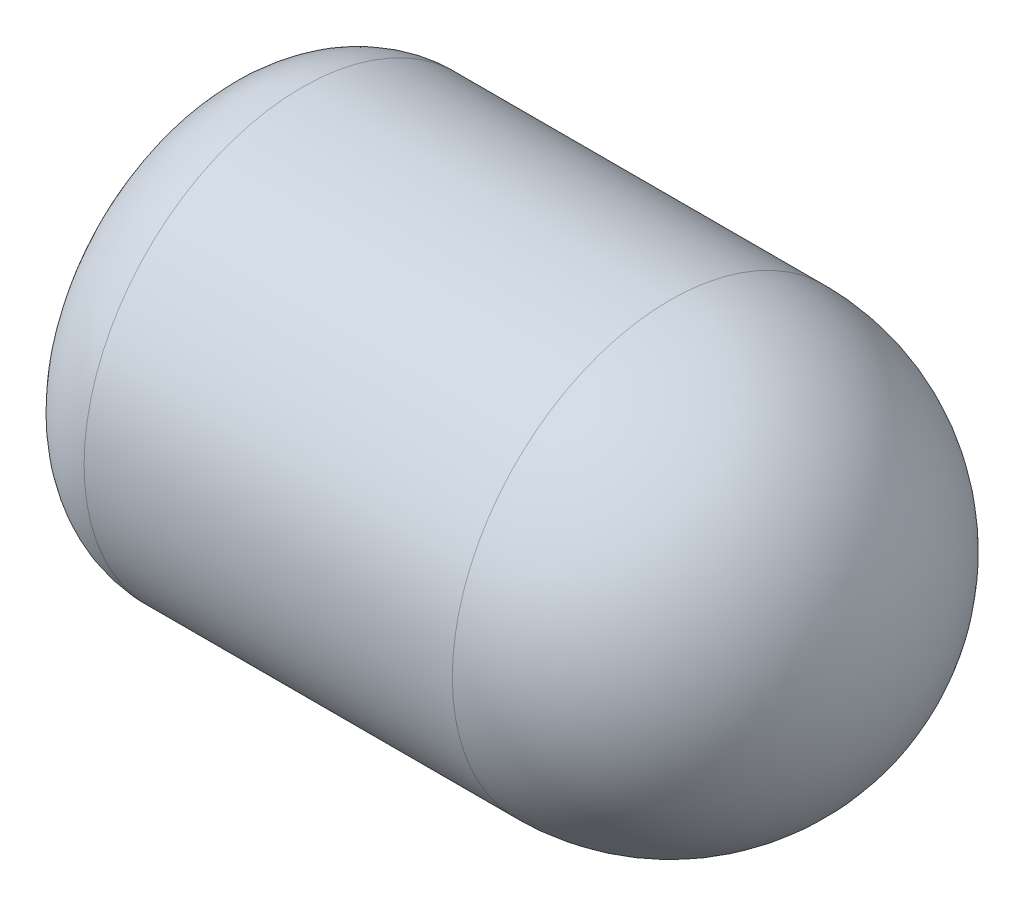
ISO-10303-21;
HEADER;
FILE_DESCRIPTION(('STEP AP214'),'2;1');
FILE_NAME('part.step','',(''),(''),'','','');
FILE_SCHEMA(('AUTOMOTIVE_DESIGN { 1 0 10303 214 1 1 1 1 }'));
ENDSEC;
DATA;
#1=APPLICATION_CONTEXT('core data for automotive mechanical design processes');
#2=APPLICATION_PROTOCOL_DEFINITION('international standard','automotive_design',2000,#1);
#3=PRODUCT_CONTEXT('',#1,'mechanical');
#4=PRODUCT('Part','Part','',(#3));
#5=PRODUCT_RELATED_PRODUCT_CATEGORY('part','',(#4));
#6=PRODUCT_DEFINITION_FORMATION('','',#4);
#7=PRODUCT_DEFINITION_CONTEXT('part definition',#1,'design');
#8=PRODUCT_DEFINITION('design','',#6,#7);
#9=PRODUCT_DEFINITION_SHAPE('','',#8);
#10=(LENGTH_UNIT() NAMED_UNIT(*) SI_UNIT(.MILLI.,.METRE.));
#11=(NAMED_UNIT(*) PLANE_ANGLE_UNIT() SI_UNIT($,.RADIAN.));
#12=(NAMED_UNIT(*) SI_UNIT($,.STERADIAN.) SOLID_ANGLE_UNIT());
#13=UNCERTAINTY_MEASURE_WITH_UNIT(LENGTH_MEASURE(1.E-05),#10,'distance_accuracy_value','');
#14=(GEOMETRIC_REPRESENTATION_CONTEXT(3) GLOBAL_UNCERTAINTY_ASSIGNED_CONTEXT((#13)) GLOBAL_UNIT_ASSIGNED_CONTEXT((#10,
#11,#12)) REPRESENTATION_CONTEXT('',''));
#15=CARTESIAN_POINT('',(0.,0.,0.));
#16=DIRECTION('',(0.,0.,1.));
#17=DIRECTION('',(1.,0.,0.));
#18=AXIS2_PLACEMENT_3D('',#15,#16,#17);
#19=CARTESIAN_POINT('',(0.,0.,0.));
#20=DIRECTION('',(-1.,0.,0.));
#21=DIRECTION('',(0.,1.,0.));
#22=AXIS2_PLACEMENT_3D('',#19,#20,#21);
#23=SPHERICAL_SURFACE('',#22,7.1);
#24=CARTESIAN_POINT('',(0.,0.,0.));
#25=DIRECTION('',(-1.,0.,0.));
#26=DIRECTION('',(0.,0.,1.));
#27=AXIS2_PLACEMENT_3D('',#24,#25,#26);
#28=CIRCLE('',#27,7.1);
#29=CARTESIAN_POINT('',(0.,0.,7.1));
#30=VERTEX_POINT('',#29);
#31=EDGE_CURVE('E41',#30,#30,#28,.T.);
#32=ORIENTED_EDGE('',*,*,#31,.F.);
#33=EDGE_LOOP('',(#32));
#34=FACE_BOUND('',#33,.T.);
#35=ADVANCED_FACE('F30',(#34),#23,.T.);
#36=CARTESIAN_POINT('',(-13.0300689167394,0.,0.));
#37=DIRECTION('',(-1.,0.,0.));
#38=DIRECTION('',(0.,0.,1.));
#39=AXIS2_PLACEMENT_3D('',#36,#37,#38);
#40=CYLINDRICAL_SURFACE('',#39,7.1);
#41=CARTESIAN_POINT('',(-12.,0.,0.));
#42=DIRECTION('',(1.,0.,0.));
#43=DIRECTION('',(0.,0.,-1.));
#44=AXIS2_PLACEMENT_3D('',#41,#42,#43);
#45=CIRCLE('',#44,7.1);
#46=CARTESIAN_POINT('',(-12.,0.,-7.1));
#47=VERTEX_POINT('',#46);
#48=EDGE_CURVE('E10',#47,#47,#45,.T.);
#49=ORIENTED_EDGE('',*,*,#48,.T.);
#50=EDGE_LOOP('',(#49));
#51=FACE_BOUND('',#50,.T.);
#52=ORIENTED_EDGE('',*,*,#31,.T.);
#53=EDGE_LOOP('',(#52));
#54=FACE_BOUND('',#53,.T.);
#55=ADVANCED_FACE('F64',(#51,#54),#40,.T.);
#56=CARTESIAN_POINT('',(-15.,7.1,0.));
#57=DIRECTION('',(1.,0.,0.));
#58=DIRECTION('',(0.,0.,-1.));
#59=AXIS2_PLACEMENT_3D('',#56,#57,#58);
#60=PLANE('',#59);
#61=CARTESIAN_POINT('',(-15.,0.,0.));
#62=DIRECTION('',(1.,0.,0.));
#63=DIRECTION('',(0.,0.,-1.));
#64=AXIS2_PLACEMENT_3D('',#61,#62,#63);
#65=CIRCLE('',#64,4.1);
#66=CARTESIAN_POINT('',(-15.,0.,-4.1));
#67=VERTEX_POINT('',#66);
#68=EDGE_CURVE('E37',#67,#67,#65,.F.);
#69=ORIENTED_EDGE('',*,*,#68,.T.);
#70=EDGE_LOOP('',(#69));
#71=FACE_BOUND('',#70,.T.);
#72=CARTESIAN_POINT('',(-15.,0.,0.));
#73=DIRECTION('',(-1.,0.,0.));
#74=DIRECTION('',(0.,0.,1.));
#75=AXIS2_PLACEMENT_3D('',#72,#73,#74);
#76=CIRCLE('',#75,3.1);
#77=CARTESIAN_POINT('',(-15.,0.,3.1));
#78=VERTEX_POINT('',#77);
#79=EDGE_CURVE('E45',#78,#78,#76,.T.);
#80=ORIENTED_EDGE('',*,*,#79,.F.);
#81=EDGE_LOOP('',(#80));
#82=FACE_BOUND('',#81,.T.);
#83=ADVANCED_FACE('F59',(#71,#82),#60,.F.);
#84=CARTESIAN_POINT('',(-13.0300689167394,0.,0.));
#85=DIRECTION('',(-1.,0.,0.));
#86=DIRECTION('',(0.,0.,1.));
#87=AXIS2_PLACEMENT_3D('',#84,#85,#86);
#88=CYLINDRICAL_SURFACE('',#87,3.1);
#89=CARTESIAN_POINT('',(0.,0.,0.));
#90=DIRECTION('',(-1.,0.,0.));
#91=DIRECTION('',(0.,0.,1.));
#92=AXIS2_PLACEMENT_3D('',#89,#90,#91);
#93=CIRCLE('',#92,3.1);
#94=CARTESIAN_POINT('',(0.,0.,3.1));
#95=VERTEX_POINT('',#94);
#96=EDGE_CURVE('E50',#95,#95,#93,.T.);
#97=ORIENTED_EDGE('',*,*,#96,.F.);
#98=EDGE_LOOP('',(#97));
#99=FACE_BOUND('',#98,.T.);
#100=ORIENTED_EDGE('',*,*,#79,.T.);
#101=EDGE_LOOP('',(#100));
#102=FACE_BOUND('',#101,.T.);
#103=ADVANCED_FACE('F56',(#99,#102),#88,.F.);
#104=CARTESIAN_POINT('',(0.,3.1,0.));
#105=DIRECTION('',(1.,0.,0.));
#106=DIRECTION('',(0.,0.,-1.));
#107=AXIS2_PLACEMENT_3D('',#104,#105,#106);
#108=PLANE('',#107);
#109=ORIENTED_EDGE('',*,*,#96,.T.);
#110=EDGE_LOOP('',(#109));
#111=FACE_BOUND('',#110,.T.);
#112=ADVANCED_FACE('F54',(#111),#108,.F.);
#113=CARTESIAN_POINT('',(-12.,0.,0.));
#114=DIRECTION('',(1.,0.,0.));
#115=DIRECTION('',(0.,0.,-1.));
#116=AXIS2_PLACEMENT_3D('',#113,#114,#115);
#117=TOROIDAL_SURFACE('',#116,4.1,3.);
#118=ORIENTED_EDGE('',*,*,#48,.F.);
#119=EDGE_LOOP('',(#118));
#120=FACE_BOUND('',#119,.T.);
#121=ORIENTED_EDGE('',*,*,#68,.F.);
#122=EDGE_LOOP('',(#121));
#123=FACE_BOUND('',#122,.T.);
#124=ADVANCED_FACE('F32',(#120,#123),#117,.T.);
#125=CLOSED_SHELL('',(#35,#55,#83,#103,#112,#124));
#126=MANIFOLD_SOLID_BREP('B2',#125);
#127=ADVANCED_BREP_SHAPE_REPRESENTATION('',(#18,#126),#14);
#128=SHAPE_DEFINITION_REPRESENTATION(#9,#127);
ENDSEC;
END-ISO-10303-21;
